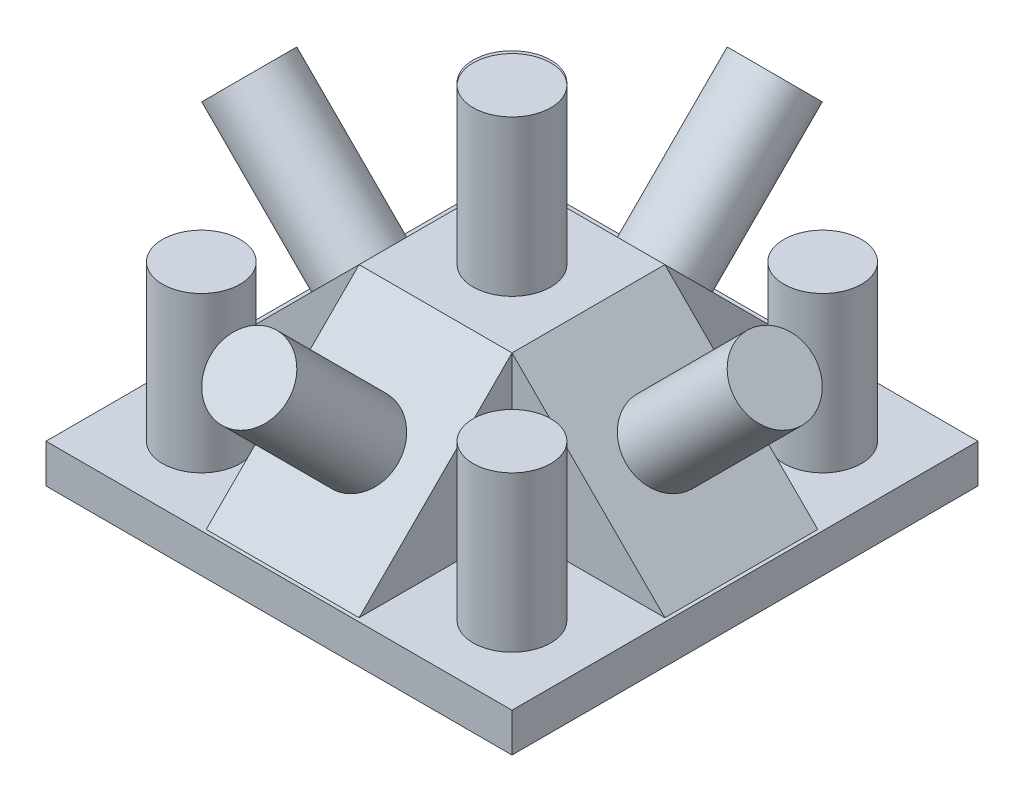
ISO-10303-21;
HEADER;
FILE_DESCRIPTION(('STEP AP214'),'2;1');
FILE_NAME('part.step','',(''),(''),'','','');
FILE_SCHEMA(('AUTOMOTIVE_DESIGN { 1 0 10303 214 1 1 1 1 }'));
ENDSEC;
DATA;
#1=APPLICATION_CONTEXT('core data for automotive mechanical design processes');
#2=APPLICATION_PROTOCOL_DEFINITION('international standard','automotive_design',2000,#1);
#3=PRODUCT_CONTEXT('',#1,'mechanical');
#4=PRODUCT('Part','Part','',(#3));
#5=PRODUCT_RELATED_PRODUCT_CATEGORY('part','',(#4));
#6=PRODUCT_DEFINITION_FORMATION('','',#4);
#7=PRODUCT_DEFINITION_CONTEXT('part definition',#1,'design');
#8=PRODUCT_DEFINITION('design','',#6,#7);
#9=PRODUCT_DEFINITION_SHAPE('','',#8);
#10=(LENGTH_UNIT() NAMED_UNIT(*) SI_UNIT(.MILLI.,.METRE.));
#11=(NAMED_UNIT(*) PLANE_ANGLE_UNIT() SI_UNIT($,.RADIAN.));
#12=(NAMED_UNIT(*) SI_UNIT($,.STERADIAN.) SOLID_ANGLE_UNIT());
#13=UNCERTAINTY_MEASURE_WITH_UNIT(LENGTH_MEASURE(1.E-05),#10,'distance_accuracy_value','');
#14=(GEOMETRIC_REPRESENTATION_CONTEXT(3) GLOBAL_UNCERTAINTY_ASSIGNED_CONTEXT((#13)) GLOBAL_UNIT_ASSIGNED_CONTEXT((#10,
#11,#12)) REPRESENTATION_CONTEXT('',''));
#15=CARTESIAN_POINT('',(0.,0.,0.));
#16=DIRECTION('',(0.,0.,1.));
#17=DIRECTION('',(1.,0.,0.));
#18=AXIS2_PLACEMENT_3D('',#15,#16,#17);
#19=CARTESIAN_POINT('',(0.,0.,0.));
#20=DIRECTION('',(0.,1.,0.));
#21=DIRECTION('',(0.,0.,1.));
#22=AXIS2_PLACEMENT_3D('',#19,#20,#21);
#23=PLANE('',#22);
#24=CARTESIAN_POINT('',(25.4,0.,-25.4));
#25=DIRECTION('',(0.,1.,0.));
#26=DIRECTION('',(0.,0.,1.));
#27=AXIS2_PLACEMENT_3D('',#24,#25,#26);
#28=CIRCLE('',#27,12.7);
#29=CARTESIAN_POINT('',(25.4,0.,-12.7));
#30=VERTEX_POINT('',#29);
#31=EDGE_CURVE('E180',#30,#30,#28,.T.);
#32=ORIENTED_EDGE('',*,*,#31,.F.);
#33=EDGE_LOOP('',(#32));
#34=FACE_BOUND('',#33,.T.);
#35=CARTESIAN_POINT('',(127.,0.,-25.4));
#36=DIRECTION('',(0.,1.,0.));
#37=DIRECTION('',(0.,0.,1.));
#38=AXIS2_PLACEMENT_3D('',#35,#36,#37);
#39=CIRCLE('',#38,12.7);
#40=CARTESIAN_POINT('',(127.,0.,-12.7));
#41=VERTEX_POINT('',#40);
#42=EDGE_CURVE('E184',#41,#41,#39,.T.);
#43=ORIENTED_EDGE('',*,*,#42,.F.);
#44=EDGE_LOOP('',(#43));
#45=FACE_BOUND('',#44,.T.);
#46=CARTESIAN_POINT('',(127.,0.,-127.));
#47=DIRECTION('',(0.,1.,0.));
#48=DIRECTION('',(0.,0.,1.));
#49=AXIS2_PLACEMENT_3D('',#46,#47,#48);
#50=CIRCLE('',#49,12.7);
#51=CARTESIAN_POINT('',(127.,0.,-114.3));
#52=VERTEX_POINT('',#51);
#53=EDGE_CURVE('E190',#52,#52,#50,.T.);
#54=ORIENTED_EDGE('',*,*,#53,.F.);
#55=EDGE_LOOP('',(#54));
#56=FACE_BOUND('',#55,.T.);
#57=CARTESIAN_POINT('',(25.4,0.,-127.));
#58=DIRECTION('',(0.,1.,0.));
#59=DIRECTION('',(0.,0.,1.));
#60=AXIS2_PLACEMENT_3D('',#57,#58,#59);
#61=CIRCLE('',#60,12.7);
#62=CARTESIAN_POINT('',(25.4,0.,-114.3));
#63=VERTEX_POINT('',#62);
#64=EDGE_CURVE('E196',#63,#63,#61,.T.);
#65=ORIENTED_EDGE('',*,*,#64,.F.);
#66=EDGE_LOOP('',(#65));
#67=FACE_BOUND('',#66,.T.);
#68=DIRECTION('',(0.,0.,1.));
#69=VECTOR('',#68,1.);
#70=CARTESIAN_POINT('',(0.,0.,-152.4));
#71=LINE('',#70,#69);
#72=CARTESIAN_POINT('',(0.,0.,-152.4));
#73=VERTEX_POINT('',#72);
#74=CARTESIAN_POINT('',(0.,0.,0.));
#75=VERTEX_POINT('',#74);
#76=EDGE_CURVE('E202',#73,#75,#71,.T.);
#77=ORIENTED_EDGE('',*,*,#76,.T.);
#78=DIRECTION('',(1.,0.,0.));
#79=VECTOR('',#78,1.);
#80=CARTESIAN_POINT('',(0.,0.,0.));
#81=LINE('',#80,#79);
#82=CARTESIAN_POINT('',(152.4,0.,0.));
#83=VERTEX_POINT('',#82);
#84=EDGE_CURVE('E217',#75,#83,#81,.T.);
#85=ORIENTED_EDGE('',*,*,#84,.T.);
#86=DIRECTION('',(0.,0.,-1.));
#87=VECTOR('',#86,1.);
#88=CARTESIAN_POINT('',(152.4,0.,-152.4));
#89=LINE('',#88,#87);
#90=CARTESIAN_POINT('',(152.4,0.,-152.4));
#91=VERTEX_POINT('',#90);
#92=EDGE_CURVE('E220',#83,#91,#89,.T.);
#93=ORIENTED_EDGE('',*,*,#92,.T.);
#94=DIRECTION('',(-1.,0.,0.));
#95=VECTOR('',#94,1.);
#96=CARTESIAN_POINT('',(0.,0.,-152.4));
#97=LINE('',#96,#95);
#98=EDGE_CURVE('E208',#91,#73,#97,.T.);
#99=ORIENTED_EDGE('',*,*,#98,.T.);
#100=EDGE_LOOP('',(#77,#85,#93,#99));
#101=FACE_BOUND('',#100,.T.);
#102=DIRECTION('',(0.,0.,1.));
#103=VECTOR('',#102,1.);
#104=CARTESIAN_POINT('',(51.2,0.,-151.2));
#105=LINE('',#104,#103);
#106=CARTESIAN_POINT('',(51.2,0.,-151.2));
#107=VERTEX_POINT('',#106);
#108=CARTESIAN_POINT('',(51.2,0.,-101.2));
#109=VERTEX_POINT('',#108);
#110=EDGE_CURVE('E382',#107,#109,#105,.T.);
#111=ORIENTED_EDGE('',*,*,#110,.F.);
#112=DIRECTION('',(-1.,0.,0.));
#113=VECTOR('',#112,1.);
#114=CARTESIAN_POINT('',(101.2,0.,-151.2));
#115=LINE('',#114,#113);
#116=CARTESIAN_POINT('',(101.2,0.,-151.2));
#117=VERTEX_POINT('',#116);
#118=EDGE_CURVE('E378',#117,#107,#115,.T.);
#119=ORIENTED_EDGE('',*,*,#118,.F.);
#120=DIRECTION('',(0.,0.,-1.));
#121=VECTOR('',#120,1.);
#122=CARTESIAN_POINT('',(101.2,0.,-101.2));
#123=LINE('',#122,#121);
#124=CARTESIAN_POINT('',(101.2,0.,-101.2));
#125=VERTEX_POINT('',#124);
#126=EDGE_CURVE('E170',#125,#117,#123,.T.);
#127=ORIENTED_EDGE('',*,*,#126,.F.);
#128=DIRECTION('',(-1.,0.,0.));
#129=VECTOR('',#128,1.);
#130=CARTESIAN_POINT('',(151.2,0.,-101.2));
#131=LINE('',#130,#129);
#132=CARTESIAN_POINT('',(151.2,0.,-101.2));
#133=VERTEX_POINT('',#132);
#134=EDGE_CURVE('E168',#133,#125,#131,.T.);
#135=ORIENTED_EDGE('',*,*,#134,.F.);
#136=DIRECTION('',(0.,0.,-1.));
#137=VECTOR('',#136,1.);
#138=CARTESIAN_POINT('',(151.2,0.,-51.2));
#139=LINE('',#138,#137);
#140=CARTESIAN_POINT('',(151.2,0.,-51.1999999999999));
#141=VERTEX_POINT('',#140);
#142=EDGE_CURVE('E163',#141,#133,#139,.T.);
#143=ORIENTED_EDGE('',*,*,#142,.F.);
#144=DIRECTION('',(1.,0.,0.));
#145=VECTOR('',#144,1.);
#146=CARTESIAN_POINT('',(101.2,0.,-51.2));
#147=LINE('',#146,#145);
#148=CARTESIAN_POINT('',(101.2,0.,-51.2));
#149=VERTEX_POINT('',#148);
#150=EDGE_CURVE('E161',#149,#141,#147,.T.);
#151=ORIENTED_EDGE('',*,*,#150,.F.);
#152=DIRECTION('',(0.,0.,-1.));
#153=VECTOR('',#152,1.);
#154=CARTESIAN_POINT('',(101.2,0.,-1.20000000000001));
#155=LINE('',#154,#153);
#156=CARTESIAN_POINT('',(101.2,0.,-1.20000000000001));
#157=VERTEX_POINT('',#156);
#158=EDGE_CURVE('E146',#157,#149,#155,.T.);
#159=ORIENTED_EDGE('',*,*,#158,.F.);
#160=DIRECTION('',(1.,0.,0.));
#161=VECTOR('',#160,1.);
#162=CARTESIAN_POINT('',(51.2,0.,-1.19999999999999));
#163=LINE('',#162,#161);
#164=CARTESIAN_POINT('',(51.2,0.,-1.2));
#165=VERTEX_POINT('',#164);
#166=EDGE_CURVE('E135',#165,#157,#163,.T.);
#167=ORIENTED_EDGE('',*,*,#166,.F.);
#168=DIRECTION('',(0.,0.,1.));
#169=VECTOR('',#168,1.);
#170=CARTESIAN_POINT('',(51.2,0.,-51.2));
#171=LINE('',#170,#169);
#172=CARTESIAN_POINT('',(51.2,0.,-51.2));
#173=VERTEX_POINT('',#172);
#174=EDGE_CURVE('E147',#173,#165,#171,.T.);
#175=ORIENTED_EDGE('',*,*,#174,.F.);
#176=DIRECTION('',(1.,0.,0.));
#177=VECTOR('',#176,1.);
#178=CARTESIAN_POINT('',(1.19999999999992,0.,-51.1999999999999));
#179=LINE('',#178,#177);
#180=CARTESIAN_POINT('',(1.19999999999992,0.,-51.1999999999999));
#181=VERTEX_POINT('',#180);
#182=EDGE_CURVE('E385',#181,#173,#179,.T.);
#183=ORIENTED_EDGE('',*,*,#182,.F.);
#184=DIRECTION('',(0.,0.,1.));
#185=VECTOR('',#184,1.);
#186=CARTESIAN_POINT('',(1.19999999999997,0.,-101.2));
#187=LINE('',#186,#185);
#188=CARTESIAN_POINT('',(1.19999999999992,0.,-101.2));
#189=VERTEX_POINT('',#188);
#190=EDGE_CURVE('E373',#189,#181,#187,.T.);
#191=ORIENTED_EDGE('',*,*,#190,.F.);
#192=DIRECTION('',(-1.,0.,0.));
#193=VECTOR('',#192,1.);
#194=CARTESIAN_POINT('',(51.2,0.,-101.2));
#195=LINE('',#194,#193);
#196=EDGE_CURVE('E381',#109,#189,#195,.T.);
#197=ORIENTED_EDGE('',*,*,#196,.F.);
#198=EDGE_LOOP('',(#111,#119,#127,#135,#143,#151,#159,#167,#175,#183,#191,#197));
#199=FACE_BOUND('',#198,.T.);
#200=ADVANCED_FACE('F35',(#34,#45,#56,#67,#101,#199),#23,.T.);
#201=CARTESIAN_POINT('',(0.,-12.7,-152.4));
#202=DIRECTION('',(-1.,0.,0.));
#203=DIRECTION('',(0.,0.,1.));
#204=AXIS2_PLACEMENT_3D('',#201,#202,#203);
#205=PLANE('',#204);
#206=ORIENTED_EDGE('',*,*,#76,.F.);
#207=DIRECTION('',(0.,1.,0.));
#208=VECTOR('',#207,1.);
#209=CARTESIAN_POINT('',(0.,-12.7,-152.4));
#210=LINE('',#209,#208);
#211=CARTESIAN_POINT('',(0.,-12.7,-152.4));
#212=VERTEX_POINT('',#211);
#213=EDGE_CURVE('E60',#212,#73,#210,.T.);
#214=ORIENTED_EDGE('',*,*,#213,.F.);
#215=DIRECTION('',(0.,0.,1.));
#216=VECTOR('',#215,1.);
#217=CARTESIAN_POINT('',(0.,-12.7,-152.4));
#218=LINE('',#217,#216);
#219=CARTESIAN_POINT('',(0.,-12.7,0.));
#220=VERTEX_POINT('',#219);
#221=EDGE_CURVE('E205',#212,#220,#218,.T.);
#222=ORIENTED_EDGE('',*,*,#221,.T.);
#223=DIRECTION('',(0.,1.,0.));
#224=VECTOR('',#223,1.);
#225=CARTESIAN_POINT('',(0.,-12.7,0.));
#226=LINE('',#225,#224);
#227=EDGE_CURVE('E86',#220,#75,#226,.T.);
#228=ORIENTED_EDGE('',*,*,#227,.T.);
#229=EDGE_LOOP('',(#206,#214,#222,#228));
#230=FACE_BOUND('',#229,.T.);
#231=ADVANCED_FACE('F37',(#230),#205,.T.);
#232=CARTESIAN_POINT('',(0.,-12.7,-152.4));
#233=DIRECTION('',(0.,0.,-1.));
#234=DIRECTION('',(-1.,0.,0.));
#235=AXIS2_PLACEMENT_3D('',#232,#233,#234);
#236=PLANE('',#235);
#237=ORIENTED_EDGE('',*,*,#98,.F.);
#238=DIRECTION('',(0.,1.,0.));
#239=VECTOR('',#238,1.);
#240=CARTESIAN_POINT('',(152.4,-12.7,-152.4));
#241=LINE('',#240,#239);
#242=CARTESIAN_POINT('',(152.4,-12.7,-152.4));
#243=VERTEX_POINT('',#242);
#244=EDGE_CURVE('E227',#243,#91,#241,.T.);
#245=ORIENTED_EDGE('',*,*,#244,.F.);
#246=DIRECTION('',(-1.,0.,0.));
#247=VECTOR('',#246,1.);
#248=CARTESIAN_POINT('',(0.,-12.7,-152.4));
#249=LINE('',#248,#247);
#250=EDGE_CURVE('E213',#243,#212,#249,.T.);
#251=ORIENTED_EDGE('',*,*,#250,.T.);
#252=ORIENTED_EDGE('',*,*,#213,.T.);
#253=EDGE_LOOP('',(#237,#245,#251,#252));
#254=FACE_BOUND('',#253,.T.);
#255=ADVANCED_FACE('F265',(#254),#236,.T.);
#256=CARTESIAN_POINT('',(152.4,-12.7,-152.4));
#257=DIRECTION('',(1.,0.,0.));
#258=DIRECTION('',(0.,0.,-1.));
#259=AXIS2_PLACEMENT_3D('',#256,#257,#258);
#260=PLANE('',#259);
#261=ORIENTED_EDGE('',*,*,#92,.F.);
#262=DIRECTION('',(0.,1.,0.));
#263=VECTOR('',#262,1.);
#264=CARTESIAN_POINT('',(152.4,-12.7,0.));
#265=LINE('',#264,#263);
#266=CARTESIAN_POINT('',(152.4,-12.7,0.));
#267=VERTEX_POINT('',#266);
#268=EDGE_CURVE('E229',#267,#83,#265,.T.);
#269=ORIENTED_EDGE('',*,*,#268,.F.);
#270=DIRECTION('',(0.,0.,-1.));
#271=VECTOR('',#270,1.);
#272=CARTESIAN_POINT('',(152.4,-12.7,-152.4));
#273=LINE('',#272,#271);
#274=EDGE_CURVE('E210',#267,#243,#273,.T.);
#275=ORIENTED_EDGE('',*,*,#274,.T.);
#276=ORIENTED_EDGE('',*,*,#244,.T.);
#277=EDGE_LOOP('',(#261,#269,#275,#276));
#278=FACE_BOUND('',#277,.T.);
#279=ADVANCED_FACE('F274',(#278),#260,.T.);
#280=CARTESIAN_POINT('',(0.,-12.7,0.));
#281=DIRECTION('',(0.,0.,1.));
#282=DIRECTION('',(1.,0.,0.));
#283=AXIS2_PLACEMENT_3D('',#280,#281,#282);
#284=PLANE('',#283);
#285=ORIENTED_EDGE('',*,*,#84,.F.);
#286=ORIENTED_EDGE('',*,*,#227,.F.);
#287=DIRECTION('',(1.,0.,0.));
#288=VECTOR('',#287,1.);
#289=CARTESIAN_POINT('',(0.,-12.7,0.));
#290=LINE('',#289,#288);
#291=EDGE_CURVE('E207',#220,#267,#290,.T.);
#292=ORIENTED_EDGE('',*,*,#291,.T.);
#293=ORIENTED_EDGE('',*,*,#268,.T.);
#294=EDGE_LOOP('',(#285,#286,#292,#293));
#295=FACE_BOUND('',#294,.T.);
#296=ADVANCED_FACE('F276',(#295),#284,.T.);
#297=CARTESIAN_POINT('',(0.,-12.7,0.));
#298=DIRECTION('',(0.,1.,0.));
#299=DIRECTION('',(0.,0.,1.));
#300=AXIS2_PLACEMENT_3D('',#297,#298,#299);
#301=PLANE('',#300);
#302=ORIENTED_EDGE('',*,*,#221,.F.);
#303=ORIENTED_EDGE('',*,*,#250,.F.);
#304=ORIENTED_EDGE('',*,*,#274,.F.);
#305=ORIENTED_EDGE('',*,*,#291,.F.);
#306=EDGE_LOOP('',(#302,#303,#304,#305));
#307=FACE_BOUND('',#306,.T.);
#308=ADVANCED_FACE('F270',(#307),#301,.F.);
#309=CARTESIAN_POINT('',(25.4,50.8,-127.));
#310=DIRECTION('',(0.,-1.,0.));
#311=DIRECTION('',(0.,0.,-1.));
#312=AXIS2_PLACEMENT_3D('',#309,#310,#311);
#313=CYLINDRICAL_SURFACE('',#312,12.7);
#314=CARTESIAN_POINT('',(25.4,50.8,-127.));
#315=DIRECTION('',(0.,1.,0.));
#316=DIRECTION('',(0.,0.,1.));
#317=AXIS2_PLACEMENT_3D('',#314,#315,#316);
#318=CIRCLE('',#317,12.7);
#319=CARTESIAN_POINT('',(25.4,50.8,-114.3));
#320=VERTEX_POINT('',#319);
#321=EDGE_CURVE('E199',#320,#320,#318,.T.);
#322=ORIENTED_EDGE('',*,*,#321,.F.);
#323=EDGE_LOOP('',(#322));
#324=FACE_BOUND('',#323,.T.);
#325=ORIENTED_EDGE('',*,*,#64,.T.);
#326=EDGE_LOOP('',(#325));
#327=FACE_BOUND('',#326,.T.);
#328=ADVANCED_FACE('F282',(#324,#327),#313,.T.);
#329=CARTESIAN_POINT('',(25.4,50.8,-127.));
#330=DIRECTION('',(0.,1.,0.));
#331=DIRECTION('',(0.,0.,1.));
#332=AXIS2_PLACEMENT_3D('',#329,#330,#331);
#333=PLANE('',#332);
#334=ORIENTED_EDGE('',*,*,#321,.T.);
#335=EDGE_LOOP('',(#334));
#336=FACE_BOUND('',#335,.T.);
#337=ADVANCED_FACE('F291',(#336),#333,.T.);
#338=CARTESIAN_POINT('',(127.,50.8,-127.));
#339=DIRECTION('',(0.,-1.,0.));
#340=DIRECTION('',(0.,0.,-1.));
#341=AXIS2_PLACEMENT_3D('',#338,#339,#340);
#342=CYLINDRICAL_SURFACE('',#341,12.7);
#343=CARTESIAN_POINT('',(127.,50.8,-127.));
#344=DIRECTION('',(0.,1.,0.));
#345=DIRECTION('',(0.,0.,1.));
#346=AXIS2_PLACEMENT_3D('',#343,#344,#345);
#347=CIRCLE('',#346,12.7);
#348=CARTESIAN_POINT('',(127.,50.8,-114.3));
#349=VERTEX_POINT('',#348);
#350=EDGE_CURVE('E193',#349,#349,#347,.T.);
#351=ORIENTED_EDGE('',*,*,#350,.F.);
#352=EDGE_LOOP('',(#351));
#353=FACE_BOUND('',#352,.T.);
#354=ORIENTED_EDGE('',*,*,#53,.T.);
#355=EDGE_LOOP('',(#354));
#356=FACE_BOUND('',#355,.T.);
#357=ADVANCED_FACE('F296',(#353,#356),#342,.T.);
#358=CARTESIAN_POINT('',(127.,50.8,-127.));
#359=DIRECTION('',(0.,1.,0.));
#360=DIRECTION('',(0.,0.,1.));
#361=AXIS2_PLACEMENT_3D('',#358,#359,#360);
#362=PLANE('',#361);
#363=ORIENTED_EDGE('',*,*,#350,.T.);
#364=EDGE_LOOP('',(#363));
#365=FACE_BOUND('',#364,.T.);
#366=ADVANCED_FACE('F304',(#365),#362,.T.);
#367=CARTESIAN_POINT('',(127.,50.8,-25.4));
#368=DIRECTION('',(0.,-1.,0.));
#369=DIRECTION('',(0.,0.,-1.));
#370=AXIS2_PLACEMENT_3D('',#367,#368,#369);
#371=CYLINDRICAL_SURFACE('',#370,12.7);
#372=CARTESIAN_POINT('',(127.,50.8,-25.4));
#373=DIRECTION('',(0.,1.,0.));
#374=DIRECTION('',(0.,0.,1.));
#375=AXIS2_PLACEMENT_3D('',#372,#373,#374);
#376=CIRCLE('',#375,12.7);
#377=CARTESIAN_POINT('',(127.,50.8,-12.7));
#378=VERTEX_POINT('',#377);
#379=EDGE_CURVE('E187',#378,#378,#376,.T.);
#380=ORIENTED_EDGE('',*,*,#379,.F.);
#381=EDGE_LOOP('',(#380));
#382=FACE_BOUND('',#381,.T.);
#383=ORIENTED_EDGE('',*,*,#42,.T.);
#384=EDGE_LOOP('',(#383));
#385=FACE_BOUND('',#384,.T.);
#386=ADVANCED_FACE('F308',(#382,#385),#371,.T.);
#387=CARTESIAN_POINT('',(127.,50.8,-25.4));
#388=DIRECTION('',(0.,1.,0.));
#389=DIRECTION('',(0.,0.,1.));
#390=AXIS2_PLACEMENT_3D('',#387,#388,#389);
#391=PLANE('',#390);
#392=ORIENTED_EDGE('',*,*,#379,.T.);
#393=EDGE_LOOP('',(#392));
#394=FACE_BOUND('',#393,.T.);
#395=ADVANCED_FACE('F312',(#394),#391,.T.);
#396=CARTESIAN_POINT('',(25.4,50.8,-25.4));
#397=DIRECTION('',(0.,-1.,0.));
#398=DIRECTION('',(0.,0.,-1.));
#399=AXIS2_PLACEMENT_3D('',#396,#397,#398);
#400=CYLINDRICAL_SURFACE('',#399,12.7);
#401=CARTESIAN_POINT('',(25.4,50.8,-25.4));
#402=DIRECTION('',(0.,1.,0.));
#403=DIRECTION('',(0.,0.,1.));
#404=AXIS2_PLACEMENT_3D('',#401,#402,#403);
#405=CIRCLE('',#404,12.7);
#406=CARTESIAN_POINT('',(25.4,50.8,-12.7));
#407=VERTEX_POINT('',#406);
#408=EDGE_CURVE('E181',#407,#407,#405,.T.);
#409=ORIENTED_EDGE('',*,*,#408,.F.);
#410=EDGE_LOOP('',(#409));
#411=FACE_BOUND('',#410,.T.);
#412=ORIENTED_EDGE('',*,*,#31,.T.);
#413=EDGE_LOOP('',(#412));
#414=FACE_BOUND('',#413,.T.);
#415=ADVANCED_FACE('F316',(#411,#414),#400,.T.);
#416=CARTESIAN_POINT('',(25.4,50.8,-25.4));
#417=DIRECTION('',(0.,1.,0.));
#418=DIRECTION('',(0.,0.,1.));
#419=AXIS2_PLACEMENT_3D('',#416,#417,#418);
#420=PLANE('',#419);
#421=ORIENTED_EDGE('',*,*,#408,.T.);
#422=EDGE_LOOP('',(#421));
#423=FACE_BOUND('',#422,.T.);
#424=ADVANCED_FACE('F320',(#423),#420,.T.);
#425=CARTESIAN_POINT('',(51.2,50.,-151.2));
#426=DIRECTION('',(1.,0.,0.));
#427=DIRECTION('',(0.,0.,-1.));
#428=AXIS2_PLACEMENT_3D('',#425,#426,#427);
#429=PLANE('',#428);
#430=DIRECTION('',(0.,-1.,0.));
#431=VECTOR('',#430,1.);
#432=CARTESIAN_POINT('',(51.2,50.,-101.2));
#433=LINE('',#432,#431);
#434=CARTESIAN_POINT('',(51.1999999999999,50.,-101.2));
#435=VERTEX_POINT('',#434);
#436=EDGE_CURVE('E177',#435,#109,#433,.T.);
#437=ORIENTED_EDGE('',*,*,#436,.F.);
#438=DIRECTION('',(0.,0.707106781186547,0.707106781186548));
#439=VECTOR('',#438,1.);
#440=CARTESIAN_POINT('',(51.2,50.,-101.2));
#441=LINE('',#440,#439);
#442=EDGE_CURVE('E155',#107,#435,#441,.T.);
#443=ORIENTED_EDGE('',*,*,#442,.F.);
#444=ORIENTED_EDGE('',*,*,#110,.T.);
#445=EDGE_LOOP('',(#437,#443,#444));
#446=FACE_BOUND('',#445,.T.);
#447=ADVANCED_FACE('F324',(#446),#429,.F.);
#448=CARTESIAN_POINT('',(51.2,50.,-101.2));
#449=DIRECTION('',(0.,0.,1.));
#450=DIRECTION('',(1.,0.,0.));
#451=AXIS2_PLACEMENT_3D('',#448,#449,#450);
#452=PLANE('',#451);
#453=ORIENTED_EDGE('',*,*,#196,.T.);
#454=DIRECTION('',(-0.707106781186548,-0.707106781186548,0.));
#455=VECTOR('',#454,1.);
#456=CARTESIAN_POINT('',(1.19999999999995,0.,-101.2));
#457=LINE('',#456,#455);
#458=EDGE_CURVE('E369',#435,#189,#457,.T.);
#459=ORIENTED_EDGE('',*,*,#458,.F.);
#460=ORIENTED_EDGE('',*,*,#436,.T.);
#461=EDGE_LOOP('',(#453,#459,#460));
#462=FACE_BOUND('',#461,.T.);
#463=ADVANCED_FACE('F328',(#462),#452,.F.);
#464=CARTESIAN_POINT('',(1.19999999999992,50.,-51.1999999999999));
#465=DIRECTION('',(0.,0.,-1.));
#466=DIRECTION('',(-1.,0.,0.));
#467=AXIS2_PLACEMENT_3D('',#464,#465,#466);
#468=PLANE('',#467);
#469=DIRECTION('',(0.,-1.,0.));
#470=VECTOR('',#469,1.);
#471=CARTESIAN_POINT('',(51.2,50.,-51.2));
#472=LINE('',#471,#470);
#473=CARTESIAN_POINT('',(51.2,50.,-51.2));
#474=VERTEX_POINT('',#473);
#475=EDGE_CURVE('E174',#474,#173,#472,.T.);
#476=ORIENTED_EDGE('',*,*,#475,.F.);
#477=DIRECTION('',(0.707106781186547,0.707106781186547,0.));
#478=VECTOR('',#477,1.);
#479=CARTESIAN_POINT('',(1.19999999999992,0.,-51.1999999999999));
#480=LINE('',#479,#478);
#481=EDGE_CURVE('E390',#181,#474,#480,.T.);
#482=ORIENTED_EDGE('',*,*,#481,.F.);
#483=ORIENTED_EDGE('',*,*,#182,.T.);
#484=EDGE_LOOP('',(#476,#482,#483));
#485=FACE_BOUND('',#484,.T.);
#486=ADVANCED_FACE('F332',(#485),#468,.F.);
#487=CARTESIAN_POINT('',(51.2,50.,-51.2));
#488=DIRECTION('',(1.,0.,0.));
#489=DIRECTION('',(0.,0.,-1.));
#490=AXIS2_PLACEMENT_3D('',#487,#488,#489);
#491=PLANE('',#490);
#492=ORIENTED_EDGE('',*,*,#174,.T.);
#493=DIRECTION('',(0.,-0.707106781186548,0.707106781186547));
#494=VECTOR('',#493,1.);
#495=CARTESIAN_POINT('',(51.2,0.,-1.19999999999999));
#496=LINE('',#495,#494);
#497=EDGE_CURVE('E141',#474,#165,#496,.T.);
#498=ORIENTED_EDGE('',*,*,#497,.F.);
#499=ORIENTED_EDGE('',*,*,#475,.T.);
#500=EDGE_LOOP('',(#492,#498,#499));
#501=FACE_BOUND('',#500,.T.);
#502=ADVANCED_FACE('F336',(#501),#491,.F.);
#503=CARTESIAN_POINT('',(101.2,50.,-1.20000000000001));
#504=DIRECTION('',(-1.,0.,0.));
#505=DIRECTION('',(0.,0.,1.));
#506=AXIS2_PLACEMENT_3D('',#503,#504,#505);
#507=PLANE('',#506);
#508=DIRECTION('',(0.,-1.,0.));
#509=VECTOR('',#508,1.);
#510=CARTESIAN_POINT('',(101.2,50.,-51.2));
#511=LINE('',#510,#509);
#512=CARTESIAN_POINT('',(101.2,50.,-51.1999999999999));
#513=VERTEX_POINT('',#512);
#514=EDGE_CURVE('E153',#513,#149,#511,.T.);
#515=ORIENTED_EDGE('',*,*,#514,.F.);
#516=DIRECTION('',(0.,0.707106781186548,-0.707106781186547));
#517=VECTOR('',#516,1.);
#518=CARTESIAN_POINT('',(101.2,0.,-1.20000000000001));
#519=LINE('',#518,#517);
#520=EDGE_CURVE('E138',#157,#513,#519,.T.);
#521=ORIENTED_EDGE('',*,*,#520,.F.);
#522=ORIENTED_EDGE('',*,*,#158,.T.);
#523=EDGE_LOOP('',(#515,#521,#522));
#524=FACE_BOUND('',#523,.T.);
#525=ADVANCED_FACE('F151',(#524),#507,.F.);
#526=CARTESIAN_POINT('',(101.2,50.,-51.2));
#527=DIRECTION('',(0.,0.,-1.));
#528=DIRECTION('',(-1.,0.,0.));
#529=AXIS2_PLACEMENT_3D('',#526,#527,#528);
#530=PLANE('',#529);
#531=ORIENTED_EDGE('',*,*,#150,.T.);
#532=DIRECTION('',(0.707106781186547,-0.707106781186547,0.));
#533=VECTOR('',#532,1.);
#534=CARTESIAN_POINT('',(101.2,50.,-51.1999999999999));
#535=LINE('',#534,#533);
#536=EDGE_CURVE('E401',#513,#141,#535,.T.);
#537=ORIENTED_EDGE('',*,*,#536,.F.);
#538=ORIENTED_EDGE('',*,*,#514,.T.);
#539=EDGE_LOOP('',(#531,#537,#538));
#540=FACE_BOUND('',#539,.T.);
#541=ADVANCED_FACE('F343',(#540),#530,.F.);
#542=CARTESIAN_POINT('',(151.2,50.,-101.2));
#543=DIRECTION('',(0.,0.,1.));
#544=DIRECTION('',(1.,0.,0.));
#545=AXIS2_PLACEMENT_3D('',#542,#543,#544);
#546=PLANE('',#545);
#547=DIRECTION('',(0.,-1.,0.));
#548=VECTOR('',#547,1.);
#549=CARTESIAN_POINT('',(101.2,50.,-101.2));
#550=LINE('',#549,#548);
#551=CARTESIAN_POINT('',(101.2,50.,-101.2));
#552=VERTEX_POINT('',#551);
#553=EDGE_CURVE('E51',#552,#125,#550,.T.);
#554=ORIENTED_EDGE('',*,*,#553,.F.);
#555=DIRECTION('',(-0.707106781186548,0.707106781186548,0.));
#556=VECTOR('',#555,1.);
#557=CARTESIAN_POINT('',(101.2,50.,-101.2));
#558=LINE('',#557,#556);
#559=EDGE_CURVE('E391',#133,#552,#558,.T.);
#560=ORIENTED_EDGE('',*,*,#559,.F.);
#561=ORIENTED_EDGE('',*,*,#134,.T.);
#562=EDGE_LOOP('',(#554,#560,#561));
#563=FACE_BOUND('',#562,.T.);
#564=ADVANCED_FACE('F346',(#563),#546,.F.);
#565=CARTESIAN_POINT('',(101.2,50.,-101.2));
#566=DIRECTION('',(-1.,0.,0.));
#567=DIRECTION('',(0.,0.,1.));
#568=AXIS2_PLACEMENT_3D('',#565,#566,#567);
#569=PLANE('',#568);
#570=ORIENTED_EDGE('',*,*,#126,.T.);
#571=DIRECTION('',(0.,-0.707106781186547,-0.707106781186548));
#572=VECTOR('',#571,1.);
#573=CARTESIAN_POINT('',(101.2,50.,-101.2));
#574=LINE('',#573,#572);
#575=EDGE_CURVE('E411',#552,#117,#574,.T.);
#576=ORIENTED_EDGE('',*,*,#575,.F.);
#577=ORIENTED_EDGE('',*,*,#553,.T.);
#578=EDGE_LOOP('',(#570,#576,#577));
#579=FACE_BOUND('',#578,.T.);
#580=ADVANCED_FACE('F350',(#579),#569,.F.);
#581=CARTESIAN_POINT('',(0.,50.,0.));
#582=DIRECTION('',(0.,1.,0.));
#583=DIRECTION('',(0.,0.,1.));
#584=AXIS2_PLACEMENT_3D('',#581,#582,#583);
#585=PLANE('',#584);
#586=CARTESIAN_POINT('',(76.2,50.,-76.1999999999999));
#587=DIRECTION('',(0.,1.,0.));
#588=DIRECTION('',(0.,0.,1.));
#589=AXIS2_PLACEMENT_3D('',#586,#587,#588);
#590=CIRCLE('',#589,12.7);
#591=CARTESIAN_POINT('',(76.2,50.,-63.4999999999999));
#592=VERTEX_POINT('',#591);
#593=EDGE_CURVE('E11',#592,#592,#590,.T.);
#594=ORIENTED_EDGE('',*,*,#593,.F.);
#595=EDGE_LOOP('',(#594));
#596=FACE_BOUND('',#595,.T.);
#597=DIRECTION('',(1.,0.,0.));
#598=VECTOR('',#597,1.);
#599=CARTESIAN_POINT('',(-19.5106781186548,50.,-51.2));
#600=LINE('',#599,#598);
#601=EDGE_CURVE('E154',#474,#513,#600,.T.);
#602=ORIENTED_EDGE('',*,*,#601,.T.);
#603=DIRECTION('',(0.,0.,1.));
#604=VECTOR('',#603,1.);
#605=CARTESIAN_POINT('',(101.2,50.,-171.910678118655));
#606=LINE('',#605,#604);
#607=EDGE_CURVE('E395',#552,#513,#606,.T.);
#608=ORIENTED_EDGE('',*,*,#607,.F.);
#609=DIRECTION('',(1.,0.,0.));
#610=VECTOR('',#609,1.);
#611=CARTESIAN_POINT('',(-19.5106781186548,50.,-101.2));
#612=LINE('',#611,#610);
#613=EDGE_CURVE('E398',#435,#552,#612,.T.);
#614=ORIENTED_EDGE('',*,*,#613,.F.);
#615=DIRECTION('',(0.,0.,1.));
#616=VECTOR('',#615,1.);
#617=CARTESIAN_POINT('',(51.1999999999999,50.,-171.910678118655));
#618=LINE('',#617,#616);
#619=EDGE_CURVE('E376',#435,#474,#618,.T.);
#620=ORIENTED_EDGE('',*,*,#619,.T.);
#621=EDGE_LOOP('',(#602,#608,#614,#620));
#622=FACE_BOUND('',#621,.T.);
#623=ADVANCED_FACE('F354',(#596,#622),#585,.T.);
#624=CARTESIAN_POINT('',(101.2,50.,-171.910678118655));
#625=DIRECTION('',(-0.707106781186548,-0.707106781186548,0.));
#626=DIRECTION('',(0.707106781186548,-0.707106781186548,0.));
#627=AXIS2_PLACEMENT_3D('',#624,#625,#626);
#628=PLANE('',#627);
#629=CARTESIAN_POINT('',(126.2,25.,-76.1999999999999));
#630=DIRECTION('',(-0.707106781186548,-0.707106781186548,0.));
#631=DIRECTION('',(0.707106781186548,-0.707106781186548,0.));
#632=AXIS2_PLACEMENT_3D('',#629,#630,#631);
#633=CIRCLE('',#632,12.7);
#634=CARTESIAN_POINT('',(135.180256121069,16.0197438789308,-76.1999999999999));
#635=VERTEX_POINT('',#634);
#636=EDGE_CURVE('E226',#635,#635,#633,.F.);
#637=ORIENTED_EDGE('',*,*,#636,.F.);
#638=EDGE_LOOP('',(#637));
#639=FACE_BOUND('',#638,.T.);
#640=ORIENTED_EDGE('',*,*,#559,.T.);
#641=ORIENTED_EDGE('',*,*,#607,.T.);
#642=ORIENTED_EDGE('',*,*,#536,.T.);
#643=ORIENTED_EDGE('',*,*,#142,.T.);
#644=EDGE_LOOP('',(#640,#641,#642,#643));
#645=FACE_BOUND('',#644,.T.);
#646=ADVANCED_FACE('F357',(#639,#645),#628,.F.);
#647=CARTESIAN_POINT('',(1.19999999999992,0.,-171.910678118655));
#648=DIRECTION('',(0.707106781186548,-0.707106781186548,0.));
#649=DIRECTION('',(0.707106781186548,0.707106781186548,0.));
#650=AXIS2_PLACEMENT_3D('',#647,#648,#649);
#651=PLANE('',#650);
#652=CARTESIAN_POINT('',(26.1999999999999,25.,-76.2));
#653=DIRECTION('',(0.707106781186548,-0.707106781186548,0.));
#654=DIRECTION('',(0.707106781186548,0.707106781186548,0.));
#655=AXIS2_PLACEMENT_3D('',#652,#653,#654);
#656=CIRCLE('',#655,12.7);
#657=CARTESIAN_POINT('',(35.1802561210691,33.9802561210692,-76.2));
#658=VERTEX_POINT('',#657);
#659=EDGE_CURVE('E236',#658,#658,#656,.F.);
#660=ORIENTED_EDGE('',*,*,#659,.F.);
#661=EDGE_LOOP('',(#660));
#662=FACE_BOUND('',#661,.T.);
#663=ORIENTED_EDGE('',*,*,#458,.T.);
#664=ORIENTED_EDGE('',*,*,#190,.T.);
#665=ORIENTED_EDGE('',*,*,#481,.T.);
#666=ORIENTED_EDGE('',*,*,#619,.F.);
#667=EDGE_LOOP('',(#663,#664,#665,#666));
#668=FACE_BOUND('',#667,.T.);
#669=ADVANCED_FACE('F256',(#662,#668),#651,.F.);
#670=CARTESIAN_POINT('',(-19.5106781186548,50.,-101.2));
#671=DIRECTION('',(0.,-0.707106781186548,0.707106781186547));
#672=DIRECTION('',(0.,-0.707106781186547,-0.707106781186548));
#673=AXIS2_PLACEMENT_3D('',#670,#671,#672);
#674=PLANE('',#673);
#675=CARTESIAN_POINT('',(76.2,25.,-126.2));
#676=DIRECTION('',(0.,-0.707106781186548,0.707106781186547));
#677=DIRECTION('',(0.,-0.707106781186547,-0.707106781186548));
#678=AXIS2_PLACEMENT_3D('',#675,#676,#677);
#679=CIRCLE('',#678,12.7);
#680=CARTESIAN_POINT('',(76.2,16.0197438789309,-135.180256121069));
#681=VERTEX_POINT('',#680);
#682=EDGE_CURVE('E234',#681,#681,#679,.F.);
#683=ORIENTED_EDGE('',*,*,#682,.F.);
#684=EDGE_LOOP('',(#683));
#685=FACE_BOUND('',#684,.T.);
#686=ORIENTED_EDGE('',*,*,#442,.T.);
#687=ORIENTED_EDGE('',*,*,#613,.T.);
#688=ORIENTED_EDGE('',*,*,#575,.T.);
#689=ORIENTED_EDGE('',*,*,#118,.T.);
#690=EDGE_LOOP('',(#686,#687,#688,#689));
#691=FACE_BOUND('',#690,.T.);
#692=ADVANCED_FACE('F247',(#685,#691),#674,.F.);
#693=CARTESIAN_POINT('',(-19.5106781186547,0.,-1.19999999999998));
#694=DIRECTION('',(0.,-0.707106781186547,-0.707106781186547));
#695=DIRECTION('',(0.,0.707106781186548,-0.707106781186547));
#696=AXIS2_PLACEMENT_3D('',#693,#694,#695);
#697=PLANE('',#696);
#698=CARTESIAN_POINT('',(76.2,25.,-26.2));
#699=DIRECTION('',(0.,-0.707106781186547,-0.707106781186547));
#700=DIRECTION('',(0.,0.707106781186548,-0.707106781186547));
#701=AXIS2_PLACEMENT_3D('',#698,#699,#700);
#702=CIRCLE('',#701,12.7);
#703=CARTESIAN_POINT('',(76.2,33.9802561210692,-35.1802561210692));
#704=VERTEX_POINT('',#703);
#705=EDGE_CURVE('E39',#704,#704,#702,.F.);
#706=ORIENTED_EDGE('',*,*,#705,.F.);
#707=EDGE_LOOP('',(#706));
#708=FACE_BOUND('',#707,.T.);
#709=ORIENTED_EDGE('',*,*,#497,.T.);
#710=ORIENTED_EDGE('',*,*,#166,.T.);
#711=ORIENTED_EDGE('',*,*,#520,.T.);
#712=ORIENTED_EDGE('',*,*,#601,.F.);
#713=EDGE_LOOP('',(#709,#710,#711,#712));
#714=FACE_BOUND('',#713,.T.);
#715=ADVANCED_FACE('F137',(#708,#714),#697,.F.);
#716=CARTESIAN_POINT('',(162.121024484277,60.9210244842767,-76.1999999999999));
#717=DIRECTION('',(-0.707106781186547,-0.707106781186548,0.));
#718=DIRECTION('',(0.707106781186548,-0.707106781186547,0.));
#719=AXIS2_PLACEMENT_3D('',#716,#717,#718);
#720=CYLINDRICAL_SURFACE('',#719,12.7);
#721=CARTESIAN_POINT('',(162.121024484277,60.9210244842767,-76.1999999999999));
#722=DIRECTION('',(0.707106781186547,0.707106781186548,0.));
#723=DIRECTION('',(-0.707106781186548,0.707106781186547,0.));
#724=AXIS2_PLACEMENT_3D('',#721,#722,#723);
#725=CIRCLE('',#724,12.7);
#726=CARTESIAN_POINT('',(153.140768363208,69.9012806053458,-76.1999999999999));
#727=VERTEX_POINT('',#726);
#728=EDGE_CURVE('E412',#727,#727,#725,.T.);
#729=ORIENTED_EDGE('',*,*,#728,.F.);
#730=EDGE_LOOP('',(#729));
#731=FACE_BOUND('',#730,.T.);
#732=ORIENTED_EDGE('',*,*,#636,.T.);
#733=EDGE_LOOP('',(#732));
#734=FACE_BOUND('',#733,.T.);
#735=ADVANCED_FACE('F246',(#731,#734),#720,.T.);
#736=CARTESIAN_POINT('',(162.121024484277,60.9210244842767,-76.1999999999999));
#737=DIRECTION('',(0.707106781186547,0.707106781186548,0.));
#738=DIRECTION('',(-0.707106781186548,0.707106781186547,0.));
#739=AXIS2_PLACEMENT_3D('',#736,#737,#738);
#740=PLANE('',#739);
#741=ORIENTED_EDGE('',*,*,#728,.T.);
#742=EDGE_LOOP('',(#741));
#743=FACE_BOUND('',#742,.T.);
#744=ADVANCED_FACE('F253',(#743),#740,.T.);
#745=CARTESIAN_POINT('',(76.2,60.9210244842766,-162.121024484277));
#746=DIRECTION('',(0.,-0.707106781186548,0.707106781186547));
#747=DIRECTION('',(0.,-0.707106781186547,-0.707106781186548));
#748=AXIS2_PLACEMENT_3D('',#745,#746,#747);
#749=CYLINDRICAL_SURFACE('',#748,12.7);
#750=CARTESIAN_POINT('',(76.2,60.9210244842766,-162.121024484277));
#751=DIRECTION('',(0.,0.707106781186548,-0.707106781186547));
#752=DIRECTION('',(0.,0.707106781186547,0.707106781186548));
#753=AXIS2_PLACEMENT_3D('',#750,#751,#752);
#754=CIRCLE('',#753,12.7);
#755=CARTESIAN_POINT('',(76.2,69.9012806053458,-153.140768363207));
#756=VERTEX_POINT('',#755);
#757=EDGE_CURVE('E414',#756,#756,#754,.T.);
#758=ORIENTED_EDGE('',*,*,#757,.F.);
#759=EDGE_LOOP('',(#758));
#760=FACE_BOUND('',#759,.T.);
#761=ORIENTED_EDGE('',*,*,#682,.T.);
#762=EDGE_LOOP('',(#761));
#763=FACE_BOUND('',#762,.T.);
#764=ADVANCED_FACE('F467',(#760,#763),#749,.T.);
#765=CARTESIAN_POINT('',(76.2,60.9210244842766,-162.121024484277));
#766=DIRECTION('',(0.,0.707106781186548,-0.707106781186547));
#767=DIRECTION('',(0.,0.707106781186547,0.707106781186548));
#768=AXIS2_PLACEMENT_3D('',#765,#766,#767);
#769=PLANE('',#768);
#770=ORIENTED_EDGE('',*,*,#757,.T.);
#771=EDGE_LOOP('',(#770));
#772=FACE_BOUND('',#771,.T.);
#773=ADVANCED_FACE('F463',(#772),#769,.T.);
#774=CARTESIAN_POINT('',(-9.72102448427668,60.9210244842766,-76.2));
#775=DIRECTION('',(0.707106781186548,-0.707106781186547,0.));
#776=DIRECTION('',(0.707106781186547,0.707106781186548,0.));
#777=AXIS2_PLACEMENT_3D('',#774,#775,#776);
#778=CYLINDRICAL_SURFACE('',#777,12.7);
#779=CARTESIAN_POINT('',(-9.72102448427668,60.9210244842766,-76.2));
#780=DIRECTION('',(-0.707106781186548,0.707106781186547,0.));
#781=DIRECTION('',(-0.707106781186547,-0.707106781186548,0.));
#782=AXIS2_PLACEMENT_3D('',#779,#780,#781);
#783=CIRCLE('',#782,12.7);
#784=CARTESIAN_POINT('',(-18.7012806053458,51.9407683632075,-76.2));
#785=VERTEX_POINT('',#784);
#786=EDGE_CURVE('E422',#785,#785,#783,.T.);
#787=ORIENTED_EDGE('',*,*,#786,.F.);
#788=EDGE_LOOP('',(#787));
#789=FACE_BOUND('',#788,.T.);
#790=ORIENTED_EDGE('',*,*,#659,.T.);
#791=EDGE_LOOP('',(#790));
#792=FACE_BOUND('',#791,.T.);
#793=ADVANCED_FACE('F459',(#789,#792),#778,.T.);
#794=CARTESIAN_POINT('',(-9.72102448427668,60.9210244842766,-76.2));
#795=DIRECTION('',(-0.707106781186548,0.707106781186547,0.));
#796=DIRECTION('',(-0.707106781186547,-0.707106781186548,0.));
#797=AXIS2_PLACEMENT_3D('',#794,#795,#796);
#798=PLANE('',#797);
#799=ORIENTED_EDGE('',*,*,#786,.T.);
#800=EDGE_LOOP('',(#799));
#801=FACE_BOUND('',#800,.T.);
#802=ADVANCED_FACE('F455',(#801),#798,.T.);
#803=CARTESIAN_POINT('',(76.2,60.9210244842766,9.7210244842766));
#804=DIRECTION('',(0.,-0.707106781186548,-0.707106781186547));
#805=DIRECTION('',(0.,0.707106781186547,-0.707106781186548));
#806=AXIS2_PLACEMENT_3D('',#803,#804,#805);
#807=CYLINDRICAL_SURFACE('',#806,12.7);
#808=CARTESIAN_POINT('',(76.2,60.9210244842766,9.7210244842766));
#809=DIRECTION('',(0.,0.707106781186548,0.707106781186547));
#810=DIRECTION('',(0.,-0.707106781186547,0.707106781186548));
#811=AXIS2_PLACEMENT_3D('',#808,#809,#810);
#812=CIRCLE('',#811,12.7);
#813=CARTESIAN_POINT('',(76.2,69.9012806053458,0.740768363207438));
#814=VERTEX_POINT('',#813);
#815=EDGE_CURVE('E425',#814,#814,#812,.T.);
#816=CARTESIAN_POINT('',(76.2,69.9012806053458,0.740768363207438));
#817=CARTESIAN_POINT('',(76.2,69.5271032669679,0.366591024829558));
#818=CARTESIAN_POINT('',(76.2,69.15292592859,-0.00758631354832301));
#819=CARTESIAN_POINT('',(76.2,68.4045712518342,-0.755940990304085));
#820=CARTESIAN_POINT('',(76.2,68.0303939134564,-1.13011832868197));
#821=CARTESIAN_POINT('',(76.2,67.2820392367006,-1.87847300543773));
#822=CARTESIAN_POINT('',(76.2,66.9078618983227,-2.25265034381561));
#823=CARTESIAN_POINT('',(76.2,66.159507221567,-3.00100502057137));
#824=CARTESIAN_POINT('',(76.2,65.7853298831891,-3.37518235894925));
#825=CARTESIAN_POINT('',(76.2,65.0369752064333,-4.12353703570502));
#826=CARTESIAN_POINT('',(76.2,64.6627978680554,-4.4977143740829));
#827=CARTESIAN_POINT('',(76.2,63.9144431912997,-5.24606905083866));
#828=CARTESIAN_POINT('',(76.2,63.5402658529218,-5.62024638921654));
#829=CARTESIAN_POINT('',(76.2,62.791911176166,-6.3686010659723));
#830=CARTESIAN_POINT('',(76.2,62.4177338377882,-6.74277840435018));
#831=CARTESIAN_POINT('',(76.2,61.6693791610324,-7.49113308110595));
#832=CARTESIAN_POINT('',(76.2,61.2952018226545,-7.86531041948383));
#833=CARTESIAN_POINT('',(76.2,60.5468471458987,-8.61366509623959));
#834=CARTESIAN_POINT('',(76.2,60.1726698075209,-8.98784243461747));
#835=CARTESIAN_POINT('',(76.2,59.4243151307651,-9.73619711137323));
#836=CARTESIAN_POINT('',(76.2,59.0501377923872,-10.1103744497511));
#837=CARTESIAN_POINT('',(76.2,58.3017831156315,-10.8587291265069));
#838=CARTESIAN_POINT('',(76.2,57.9276057772536,-11.2329064648848));
#839=CARTESIAN_POINT('',(76.2,57.1792511004978,-11.9812611416405));
#840=CARTESIAN_POINT('',(76.2,56.8050737621199,-12.3554384800184));
#841=CARTESIAN_POINT('',(76.2,56.0567190853642,-13.1037931567742));
#842=CARTESIAN_POINT('',(76.2,55.6825417469863,-13.477970495152));
#843=CARTESIAN_POINT('',(76.2,54.9341870702305,-14.2263251719078));
#844=CARTESIAN_POINT('',(76.2,54.5600097318526,-14.6005025102857));
#845=CARTESIAN_POINT('',(76.2,53.8116550550969,-15.3488571870415));
#846=CARTESIAN_POINT('',(76.2,53.437477716719,-15.7230345254193));
#847=CARTESIAN_POINT('',(76.2,52.6891230399632,-16.4713892021751));
#848=CARTESIAN_POINT('',(76.2,52.3149457015854,-16.845566540553));
#849=CARTESIAN_POINT('',(76.2,51.5665910248296,-17.5939212173087));
#850=CARTESIAN_POINT('',(76.2,51.1924136864517,-17.9680985556866));
#851=CARTESIAN_POINT('',(76.2,50.4440590096959,-18.7164532324424));
#852=CARTESIAN_POINT('',(76.2,50.0698816713181,-19.0906305708203));
#853=CARTESIAN_POINT('',(76.2,49.3215269945623,-19.838985247576));
#854=CARTESIAN_POINT('',(76.2,48.9473496561844,-20.2131625859539));
#855=CARTESIAN_POINT('',(76.2,48.1989949794287,-20.9615172627097));
#856=CARTESIAN_POINT('',(76.2,47.8248176410508,-21.3356946010875));
#857=CARTESIAN_POINT('',(76.2,47.076462964295,-22.0840492778433));
#858=CARTESIAN_POINT('',(76.2,46.7022856259171,-22.4582266162212));
#859=CARTESIAN_POINT('',(76.2,45.9539309491614,-23.206581292977));
#860=CARTESIAN_POINT('',(76.2,45.5797536107835,-23.5807586313548));
#861=CARTESIAN_POINT('',(76.2,44.8313989340277,-24.3291133081106));
#862=CARTESIAN_POINT('',(76.2,44.4572215956498,-24.7032906464885));
#863=CARTESIAN_POINT('',(76.2,43.7088669188941,-25.4516453232442));
#864=CARTESIAN_POINT('',(76.2,43.3346895805162,-25.8258226616221));
#865=CARTESIAN_POINT('',(76.2,42.5863349037604,-26.5741773383779));
#866=CARTESIAN_POINT('',(76.2,42.2121575653826,-26.9483546767558));
#867=CARTESIAN_POINT('',(76.2,41.4638028886268,-27.6967093535115));
#868=CARTESIAN_POINT('',(76.2,41.0896255502489,-28.0708866918894));
#869=CARTESIAN_POINT('',(76.2,40.3412708734932,-28.8192413686452));
#870=CARTESIAN_POINT('',(76.2,39.9670935351153,-29.1934187070231));
#871=CARTESIAN_POINT('',(76.2,39.2187388583595,-29.9417733837788));
#872=CARTESIAN_POINT('',(76.2,38.8445615199816,-30.3159507221567));
#873=CARTESIAN_POINT('',(76.2,38.0962068432259,-31.0643053989125));
#874=CARTESIAN_POINT('',(76.2,37.722029504848,-31.4384827372903));
#875=CARTESIAN_POINT('',(76.2,36.9736748280922,-32.1868374140461));
#876=CARTESIAN_POINT('',(76.2,36.5994974897143,-32.561014752424));
#877=CARTESIAN_POINT('',(76.2,35.8511428129586,-33.3093694291797));
#878=CARTESIAN_POINT('',(76.2,35.4769654745807,-33.6835467675576));
#879=CARTESIAN_POINT('',(76.2,34.7286107978249,-34.4319014443134));
#880=CARTESIAN_POINT('',(76.2,34.354433459447,-34.8060787826913));
#881=CARTESIAN_POINT('',(76.2,33.9802561210692,-35.1802561210692));
#882=B_SPLINE_CURVE_WITH_KNOTS('',3,(#816,#817,#818,#819,#820,#821,#822,#823,#824,#825,#826,
#827,#828,#829,#830,#831,#832,#833,#834,#835,#836,#837,#838,#839,#840,#841,#842,#843,#844,#845,
#846,#847,#848,#849,#850,#851,#852,#853,#854,#855,#856,#857,#858,#859,#860,#861,#862,#863,#864,
#865,#866,#867,#868,#869,#870,#871,#872,#873,#874,#875,#876,#877,#878,#879,#880,#881),
.UNSPECIFIED.,.F.,.F.,(4,2,2,2,2,2,2,2,2,2,2,2,2,2,2,2,2,2,2,2,2,2,2,2,2,2,2,2,2,2,2,2,4),(0.,
1.58750000000001,3.175,4.7625,6.35,7.9375,9.525,11.1125,12.7,14.2875,15.875,17.4625,19.05,
20.6375,22.225,23.8125,25.4,26.9875,28.575,30.1625,31.75,33.3375,34.925,36.5125,38.1,39.6875,
41.275,42.8625,44.45,46.0375,47.625,49.2125,50.8),.UNSPECIFIED.);
#883=EDGE_CURVE('BSEAM243',#814,#704,#882,.T.);
#884=ORIENTED_EDGE('',*,*,#815,.F.);
#885=ORIENTED_EDGE('',*,*,#705,.T.);
#886=ORIENTED_EDGE('',*,*,#883,.T.);
#887=ORIENTED_EDGE('',*,*,#883,.F.);
#888=EDGE_LOOP('',(#884,#886,#885,#887));
#889=FACE_BOUND('',#888,.T.);
#890=ADVANCED_FACE('F243',(#889),#807,.T.);
#891=CARTESIAN_POINT('',(76.2,60.9210244842766,9.7210244842766));
#892=DIRECTION('',(0.,0.707106781186548,0.707106781186547));
#893=DIRECTION('',(0.,-0.707106781186547,0.707106781186548));
#894=AXIS2_PLACEMENT_3D('',#891,#892,#893);
#895=PLANE('',#894);
#896=ORIENTED_EDGE('',*,*,#815,.T.);
#897=EDGE_LOOP('',(#896));
#898=FACE_BOUND('',#897,.T.);
#899=ADVANCED_FACE('F437',(#898),#895,.T.);
#900=CARTESIAN_POINT('',(76.2,100.8,-76.1999999999999));
#901=DIRECTION('',(0.,-1.,0.));
#902=DIRECTION('',(0.,0.,-1.));
#903=AXIS2_PLACEMENT_3D('',#900,#901,#902);
#904=CYLINDRICAL_SURFACE('',#903,12.7);
#905=CARTESIAN_POINT('',(76.2,100.8,-76.1999999999999));
#906=DIRECTION('',(0.,1.,0.));
#907=DIRECTION('',(0.,0.,1.));
#908=AXIS2_PLACEMENT_3D('',#905,#906,#907);
#909=CIRCLE('',#908,12.7);
#910=CARTESIAN_POINT('',(76.2,100.8,-63.4999999999999));
#911=VERTEX_POINT('',#910);
#912=EDGE_CURVE('E427',#911,#911,#909,.T.);
#913=ORIENTED_EDGE('',*,*,#912,.F.);
#914=EDGE_LOOP('',(#913));
#915=FACE_BOUND('',#914,.T.);
#916=ORIENTED_EDGE('',*,*,#593,.T.);
#917=EDGE_LOOP('',(#916));
#918=FACE_BOUND('',#917,.T.);
#919=ADVANCED_FACE('F434',(#915,#918),#904,.T.);
#920=CARTESIAN_POINT('',(76.2,100.8,-76.1999999999999));
#921=DIRECTION('',(0.,1.,0.));
#922=DIRECTION('',(0.,0.,1.));
#923=AXIS2_PLACEMENT_3D('',#920,#921,#922);
#924=PLANE('',#923);
#925=ORIENTED_EDGE('',*,*,#912,.T.);
#926=EDGE_LOOP('',(#925));
#927=FACE_BOUND('',#926,.T.);
#928=ADVANCED_FACE('F432',(#927),#924,.T.);
#929=CLOSED_SHELL('',(#200,#231,#255,#279,#296,#308,#328,#337,#357,#366,#386,#395,#415,#424,
#447,#463,#486,#502,#525,#541,#564,#580,#623,#646,#669,#692,#715,#735,#744,#764,#773,#793,#802,
#890,#899,#919,#928));
#930=MANIFOLD_SOLID_BREP('B2',#929);
#931=ADVANCED_BREP_SHAPE_REPRESENTATION('',(#18,#930),#14);
#932=SHAPE_DEFINITION_REPRESENTATION(#9,#931);
ENDSEC;
END-ISO-10303-21;
